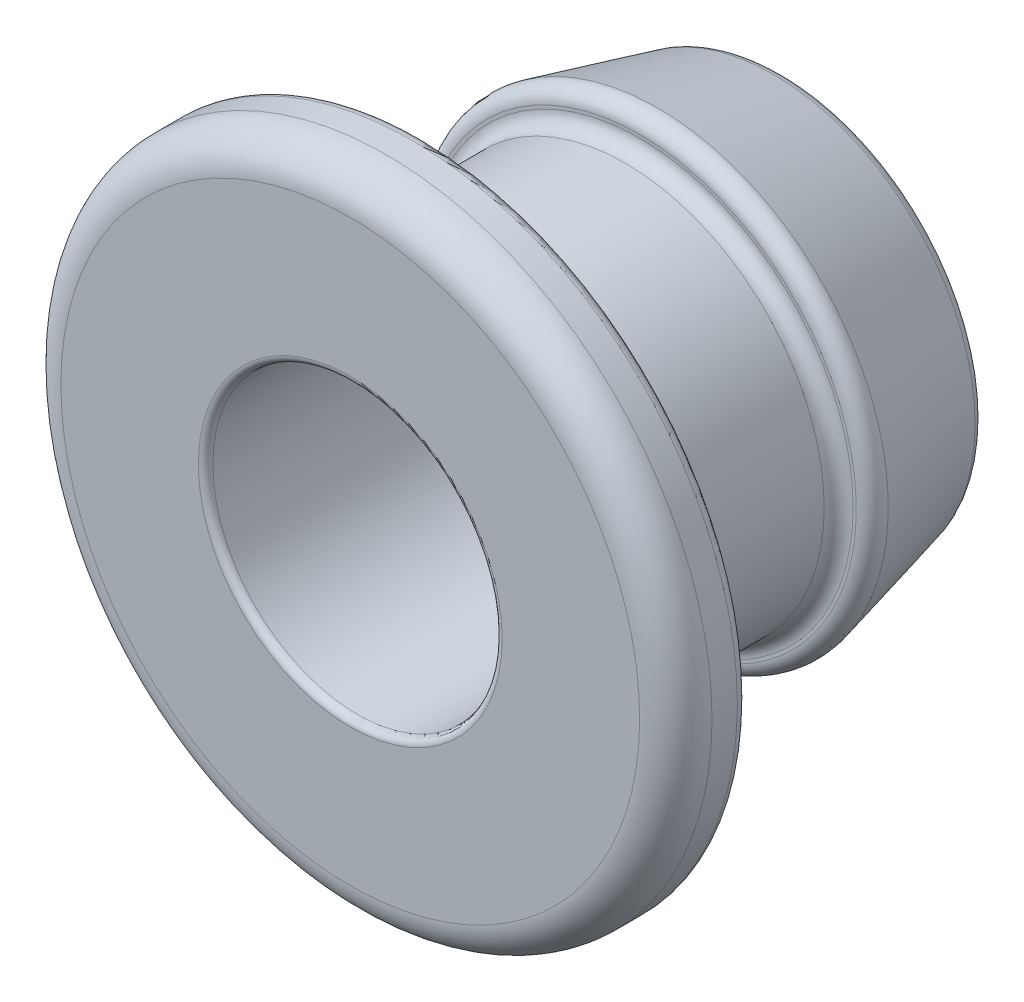
ISO-10303-21;
HEADER;
FILE_DESCRIPTION(('STEP AP214'),'2;1');
FILE_NAME('part.step','',(''),(''),'','','');
FILE_SCHEMA(('AUTOMOTIVE_DESIGN { 1 0 10303 214 1 1 1 1 }'));
ENDSEC;
DATA;
#1=APPLICATION_CONTEXT('core data for automotive mechanical design processes');
#2=APPLICATION_PROTOCOL_DEFINITION('international standard','automotive_design',2000,#1);
#3=PRODUCT_CONTEXT('',#1,'mechanical');
#4=PRODUCT('Part','Part','',(#3));
#5=PRODUCT_RELATED_PRODUCT_CATEGORY('part','',(#4));
#6=PRODUCT_DEFINITION_FORMATION('','',#4);
#7=PRODUCT_DEFINITION_CONTEXT('part definition',#1,'design');
#8=PRODUCT_DEFINITION('design','',#6,#7);
#9=PRODUCT_DEFINITION_SHAPE('','',#8);
#10=(LENGTH_UNIT() NAMED_UNIT(*) SI_UNIT(.MILLI.,.METRE.));
#11=(NAMED_UNIT(*) PLANE_ANGLE_UNIT() SI_UNIT($,.RADIAN.));
#12=(NAMED_UNIT(*) SI_UNIT($,.STERADIAN.) SOLID_ANGLE_UNIT());
#13=UNCERTAINTY_MEASURE_WITH_UNIT(LENGTH_MEASURE(1.E-05),#10,'distance_accuracy_value','');
#14=(GEOMETRIC_REPRESENTATION_CONTEXT(3) GLOBAL_UNCERTAINTY_ASSIGNED_CONTEXT((#13)) GLOBAL_UNIT_ASSIGNED_CONTEXT((#10,
#11,#12)) REPRESENTATION_CONTEXT('',''));
#15=CARTESIAN_POINT('',(0.,0.,0.));
#16=DIRECTION('',(0.,0.,1.));
#17=DIRECTION('',(1.,0.,0.));
#18=AXIS2_PLACEMENT_3D('',#15,#16,#17);
#19=CARTESIAN_POINT('',(1.09510500280763E-13,0.,9.8999999946356));
#20=DIRECTION('',(0.,0.,-1.));
#21=DIRECTION('',(-1.,0.,0.));
#22=AXIS2_PLACEMENT_3D('',#19,#20,#21);
#23=TOROIDAL_SURFACE('',#22,4.,0.5);
#24=CARTESIAN_POINT('',(1.09510500280763E-13,0.,9.8999999946356));
#25=DIRECTION('',(0.,0.,1.));
#26=DIRECTION('',(1.,0.,0.));
#27=AXIS2_PLACEMENT_3D('',#24,#25,#26);
#28=CIRCLE('',#27,4.5);
#29=CARTESIAN_POINT('',(4.50000000000011,0.,9.89999999463554));
#30=VERTEX_POINT('',#29);
#31=CARTESIAN_POINT('',(-4.49999999999989,0.,9.89999999463565));
#32=VERTEX_POINT('',#31);
#33=EDGE_CURVE('E152',#30,#32,#28,.T.);
#34=ORIENTED_EDGE('',*,*,#33,.T.);
#35=CARTESIAN_POINT('',(1.09510500280763E-13,0.,9.8999999946356));
#36=DIRECTION('',(0.,0.,1.));
#37=DIRECTION('',(1.,0.,0.));
#38=AXIS2_PLACEMENT_3D('',#35,#36,#37);
#39=CIRCLE('',#38,4.5);
#40=EDGE_CURVE('E156',#32,#30,#39,.T.);
#41=ORIENTED_EDGE('',*,*,#40,.T.);
#42=CARTESIAN_POINT('',(4.00000000000011,0.,9.89999999463555));
#43=DIRECTION('',(0.,-1.,0.));
#44=DIRECTION('',(1.,0.,0.));
#45=AXIS2_PLACEMENT_3D('',#42,#43,#44);
#46=CIRCLE('',#45,0.5);
#47=CARTESIAN_POINT('',(4.00000000000012,0.,10.3999999946356));
#48=VERTEX_POINT('',#47);
#49=EDGE_CURVE('E11',#30,#48,#46,.T.);
#50=ORIENTED_EDGE('',*,*,#49,.T.);
#51=CARTESIAN_POINT('',(1.15631708112494E-13,0.,10.3999999946356));
#52=DIRECTION('',(0.,0.,-1.));
#53=DIRECTION('',(1.,0.,0.));
#54=AXIS2_PLACEMENT_3D('',#51,#52,#53);
#55=CIRCLE('',#54,4.);
#56=EDGE_CURVE('E25',#48,#48,#55,.T.);
#57=ORIENTED_EDGE('',*,*,#56,.T.);
#58=ORIENTED_EDGE('',*,*,#49,.F.);
#59=EDGE_LOOP('',(#34,#41,#50,#57,#58));
#60=FACE_BOUND('',#59,.T.);
#61=ADVANCED_FACE('F17',(#60),#23,.T.);
#62=CARTESIAN_POINT('',(1.13890160039306E-13,0.,10.3999999946356));
#63=DIRECTION('',(0.,0.,1.));
#64=DIRECTION('',(1.,0.,0.));
#65=AXIS2_PLACEMENT_3D('',#62,#63,#64);
#66=PLANE('',#65);
#67=CARTESIAN_POINT('',(1.07551030389132E-13,0.,10.3999999946356));
#68=DIRECTION('',(0.,0.,1.));
#69=DIRECTION('',(-1.,0.,0.));
#70=AXIS2_PLACEMENT_3D('',#67,#68,#69);
#71=CIRCLE('',#70,2.1);
#72=CARTESIAN_POINT('',(2.10000000000011,0.,10.3999999946356));
#73=VERTEX_POINT('',#72);
#74=EDGE_CURVE('E177',#73,#73,#71,.T.);
#75=ORIENTED_EDGE('',*,*,#74,.F.);
#76=EDGE_LOOP('',(#75));
#77=FACE_BOUND('',#76,.T.);
#78=ORIENTED_EDGE('',*,*,#56,.F.);
#79=EDGE_LOOP('',(#78));
#80=FACE_BOUND('',#79,.T.);
#81=ADVANCED_FACE('F235',(#77,#80),#66,.T.);
#82=CARTESIAN_POINT('',(1.06326788822785E-13,0.,10.2999999946356));
#83=DIRECTION('',(0.,0.,-1.));
#84=DIRECTION('',(-1.,0.,0.));
#85=AXIS2_PLACEMENT_3D('',#82,#83,#84);
#86=TOROIDAL_SURFACE('',#85,2.1,0.1);
#87=ORIENTED_EDGE('',*,*,#74,.T.);
#88=CARTESIAN_POINT('',(2.10000000000011,0.,10.2999999946356));
#89=DIRECTION('',(0.,-1.,0.));
#90=DIRECTION('',(1.,0.,0.));
#91=AXIS2_PLACEMENT_3D('',#88,#89,#90);
#92=CIRCLE('',#91,0.1);
#93=CARTESIAN_POINT('',(2.00000000000011,0.,10.2999999946356));
#94=VERTEX_POINT('',#93);
#95=EDGE_CURVE('E44',#73,#94,#92,.T.);
#96=ORIENTED_EDGE('',*,*,#95,.T.);
#97=CARTESIAN_POINT('',(1.06326788822785E-13,0.,10.2999999946356));
#98=DIRECTION('',(0.,0.,-1.));
#99=DIRECTION('',(-1.,0.,0.));
#100=AXIS2_PLACEMENT_3D('',#97,#98,#99);
#101=CIRCLE('',#100,2.);
#102=CARTESIAN_POINT('',(-1.99999999999989,0.,10.2999999946356));
#103=VERTEX_POINT('',#102);
#104=EDGE_CURVE('E199',#94,#103,#101,.T.);
#105=ORIENTED_EDGE('',*,*,#104,.T.);
#106=CARTESIAN_POINT('',(1.06326788822785E-13,0.,10.2999999946356));
#107=DIRECTION('',(0.,0.,-1.));
#108=DIRECTION('',(-1.,0.,0.));
#109=AXIS2_PLACEMENT_3D('',#106,#107,#108);
#110=CIRCLE('',#109,2.);
#111=EDGE_CURVE('E203',#103,#94,#110,.T.);
#112=ORIENTED_EDGE('',*,*,#111,.T.);
#113=ORIENTED_EDGE('',*,*,#95,.F.);
#114=EDGE_LOOP('',(#87,#96,#105,#112,#113));
#115=FACE_BOUND('',#114,.T.);
#116=ADVANCED_FACE('F237',(#115),#86,.T.);
#117=CARTESIAN_POINT('',(0.,0.,6.59999999463559));
#118=DIRECTION('',(0.,0.,1.));
#119=DIRECTION('',(1.,0.,0.));
#120=AXIS2_PLACEMENT_3D('',#117,#118,#119);
#121=TOROIDAL_SURFACE('',#120,2.95,0.2);
#122=CARTESIAN_POINT('',(0.,0.,6.59999999463559));
#123=DIRECTION('',(0.,0.,-1.));
#124=DIRECTION('',(-1.,0.,0.));
#125=AXIS2_PLACEMENT_3D('',#122,#123,#124);
#126=CIRCLE('',#125,2.75);
#127=CARTESIAN_POINT('',(-2.74999999999993,0.,6.59999999463561));
#128=VERTEX_POINT('',#127);
#129=EDGE_CURVE('E150',#128,#128,#126,.T.);
#130=ORIENTED_EDGE('',*,*,#129,.T.);
#131=CARTESIAN_POINT('',(-2.94999999999993,0.,6.59999999463562));
#132=DIRECTION('',(0.,1.,0.));
#133=DIRECTION('',(-1.,0.,0.));
#134=AXIS2_PLACEMENT_3D('',#131,#132,#133);
#135=CIRCLE('',#134,0.2);
#136=CARTESIAN_POINT('',(-2.94999999999993,0.,6.39999999463562));
#137=VERTEX_POINT('',#136);
#138=EDGE_CURVE('E227',#128,#137,#135,.T.);
#139=ORIENTED_EDGE('',*,*,#138,.T.);
#140=CARTESIAN_POINT('',(0.,0.,6.39999999463559));
#141=DIRECTION('',(0.,0.,1.));
#142=DIRECTION('',(-1.,0.,0.));
#143=AXIS2_PLACEMENT_3D('',#140,#141,#142);
#144=CIRCLE('',#143,2.95);
#145=EDGE_CURVE('E223',#137,#137,#144,.T.);
#146=ORIENTED_EDGE('',*,*,#145,.T.);
#147=ORIENTED_EDGE('',*,*,#138,.F.);
#148=EDGE_LOOP('',(#130,#139,#146,#147));
#149=FACE_BOUND('',#148,.T.);
#150=ADVANCED_FACE('F245',(#149),#121,.F.);
#151=CARTESIAN_POINT('',(2.75000000000007,0.,6.39999999463556));
#152=DIRECTION('',(0.,0.,1.));
#153=DIRECTION('',(1.,0.,0.));
#154=AXIS2_PLACEMENT_3D('',#151,#152,#153);
#155=PLANE('',#154);
#156=ORIENTED_EDGE('',*,*,#145,.F.);
#157=EDGE_LOOP('',(#156));
#158=FACE_BOUND('',#157,.T.);
#159=CARTESIAN_POINT('',(0.,0.,6.39999999463559));
#160=DIRECTION('',(0.,0.,-1.));
#161=DIRECTION('',(-1.,0.,0.));
#162=AXIS2_PLACEMENT_3D('',#159,#160,#161);
#163=CIRCLE('',#162,2.99384471871913);
#164=CARTESIAN_POINT('',(-2.99384471871906,0.,6.39999999463562));
#165=VERTEX_POINT('',#164);
#166=EDGE_CURVE('E216',#165,#165,#163,.T.);
#167=ORIENTED_EDGE('',*,*,#166,.F.);
#168=EDGE_LOOP('',(#167));
#169=FACE_BOUND('',#168,.T.);
#170=ADVANCED_FACE('F251',(#158,#169),#155,.T.);
#171=CARTESIAN_POINT('',(0.,0.,6.19999999463559));
#172=DIRECTION('',(0.,0.,1.));
#173=DIRECTION('',(1.,0.,0.));
#174=AXIS2_PLACEMENT_3D('',#171,#172,#173);
#175=TOROIDAL_SURFACE('',#174,2.99384471871913,0.2);
#176=ORIENTED_EDGE('',*,*,#166,.T.);
#177=CARTESIAN_POINT('',(-2.99384471871907,0.,6.19999999463562));
#178=DIRECTION('',(0.,-1.,0.));
#179=DIRECTION('',(-1.,0.,0.));
#180=AXIS2_PLACEMENT_3D('',#177,#178,#179);
#181=CIRCLE('',#180,0.2);
#182=CARTESIAN_POINT('',(-3.18787321874813,0.,6.15149286962836));
#183=VERTEX_POINT('',#182);
#184=EDGE_CURVE('E220',#165,#183,#181,.T.);
#185=ORIENTED_EDGE('',*,*,#184,.T.);
#186=CARTESIAN_POINT('',(0.,0.,6.15149286962832));
#187=DIRECTION('',(0.,0.,1.));
#188=DIRECTION('',(-1.,0.,0.));
#189=AXIS2_PLACEMENT_3D('',#186,#187,#188);
#190=CIRCLE('',#189,3.18787321874819);
#191=EDGE_CURVE('E140',#183,#183,#190,.T.);
#192=ORIENTED_EDGE('',*,*,#191,.T.);
#193=ORIENTED_EDGE('',*,*,#184,.F.);
#194=EDGE_LOOP('',(#176,#185,#192,#193));
#195=FACE_BOUND('',#194,.T.);
#196=ADVANCED_FACE('F257',(#195),#175,.T.);
#197=CARTESIAN_POINT('',(0.,0.,5.39999999463559));
#198=DIRECTION('',(0.,0.,1.));
#199=DIRECTION('',(1.,0.,0.));
#200=AXIS2_PLACEMENT_3D('',#197,#198,#199);
#201=CONICAL_SURFACE('',#200,3.,0.244978663126864);
#202=ORIENTED_EDGE('',*,*,#191,.F.);
#203=DIRECTION('',(0.242535625036322,0.,-0.970142500145335));
#204=VECTOR('',#203,1.);
#205=CARTESIAN_POINT('',(-2.99999999999996,0.,5.39999999463562));
#206=LINE('',#205,#204);
#207=CARTESIAN_POINT('',(-2.78787321874815,0.,4.55149286962836));
#208=VERTEX_POINT('',#207);
#209=EDGE_CURVE('E213',#183,#208,#206,.T.);
#210=ORIENTED_EDGE('',*,*,#209,.T.);
#211=CARTESIAN_POINT('',(0.,0.,4.55149286962832));
#212=DIRECTION('',(0.,0.,-1.));
#213=DIRECTION('',(1.,0.,0.));
#214=AXIS2_PLACEMENT_3D('',#211,#212,#213);
#215=CIRCLE('',#214,2.78787321874819);
#216=EDGE_CURVE('E206',#208,#208,#215,.T.);
#217=ORIENTED_EDGE('',*,*,#216,.F.);
#218=ORIENTED_EDGE('',*,*,#209,.F.);
#219=EDGE_LOOP('',(#202,#210,#217,#218));
#220=FACE_BOUND('',#219,.T.);
#221=ADVANCED_FACE('F253',(#220),#201,.T.);
#222=CARTESIAN_POINT('',(0.,0.,4.59999999463559));
#223=DIRECTION('',(0.,0.,1.));
#224=DIRECTION('',(1.,0.,0.));
#225=AXIS2_PLACEMENT_3D('',#222,#223,#224);
#226=TOROIDAL_SURFACE('',#225,2.59384471871913,0.2);
#227=ORIENTED_EDGE('',*,*,#216,.T.);
#228=CARTESIAN_POINT('',(-2.59384471871909,0.,4.59999999463562));
#229=DIRECTION('',(0.,-1.,0.));
#230=DIRECTION('',(-1.,0.,0.));
#231=AXIS2_PLACEMENT_3D('',#228,#229,#230);
#232=CIRCLE('',#231,0.2);
#233=CARTESIAN_POINT('',(-2.59384471871909,0.,4.39999999463562));
#234=VERTEX_POINT('',#233);
#235=EDGE_CURVE('E210',#208,#234,#232,.T.);
#236=ORIENTED_EDGE('',*,*,#235,.T.);
#237=CARTESIAN_POINT('',(0.,0.,4.39999999463559));
#238=DIRECTION('',(0.,0.,1.));
#239=DIRECTION('',(1.,0.,0.));
#240=AXIS2_PLACEMENT_3D('',#237,#238,#239);
#241=CIRCLE('',#240,2.59384471871913);
#242=EDGE_CURVE('E191',#234,#234,#241,.T.);
#243=ORIENTED_EDGE('',*,*,#242,.T.);
#244=ORIENTED_EDGE('',*,*,#235,.F.);
#245=EDGE_LOOP('',(#227,#236,#243,#244));
#246=FACE_BOUND('',#245,.T.);
#247=ADVANCED_FACE('F256',(#246),#226,.T.);
#248=CARTESIAN_POINT('',(0.,0.,8.59999999463559));
#249=DIRECTION('',(0.,0.,1.));
#250=DIRECTION('',(1.,0.,0.));
#251=AXIS2_PLACEMENT_3D('',#248,#249,#250);
#252=CYLINDRICAL_SURFACE('',#251,2.);
#253=CARTESIAN_POINT('',(0.,0.,4.59999999463559));
#254=DIRECTION('',(0.,0.,1.));
#255=DIRECTION('',(1.,0.,0.));
#256=AXIS2_PLACEMENT_3D('',#253,#254,#255);
#257=CIRCLE('',#256,2.);
#258=CARTESIAN_POINT('',(-1.99999999999996,0.,4.59999999463561));
#259=VERTEX_POINT('',#258);
#260=CARTESIAN_POINT('',(2.00000000000004,0.,4.59999999463557));
#261=VERTEX_POINT('',#260);
#262=EDGE_CURVE('E162',#259,#261,#257,.T.);
#263=ORIENTED_EDGE('',*,*,#262,.F.);
#264=DIRECTION('',(0.,0.,1.));
#265=VECTOR('',#264,1.);
#266=CARTESIAN_POINT('',(-1.99999999999991,0.,8.59999999463561));
#267=LINE('',#266,#265);
#268=EDGE_CURVE('E195',#259,#103,#267,.T.);
#269=ORIENTED_EDGE('',*,*,#268,.T.);
#270=ORIENTED_EDGE('',*,*,#104,.F.);
#271=ORIENTED_EDGE('',*,*,#111,.F.);
#272=ORIENTED_EDGE('',*,*,#268,.F.);
#273=CARTESIAN_POINT('',(0.,0.,4.59999999463559));
#274=DIRECTION('',(0.,0.,1.));
#275=DIRECTION('',(1.,0.,0.));
#276=AXIS2_PLACEMENT_3D('',#273,#274,#275);
#277=CIRCLE('',#276,2.);
#278=EDGE_CURVE('E187',#261,#259,#277,.T.);
#279=ORIENTED_EDGE('',*,*,#278,.F.);
#280=EDGE_LOOP('',(#263,#269,#270,#271,#272,#279));
#281=FACE_BOUND('',#280,.T.);
#282=ADVANCED_FACE('F259',(#281),#252,.F.);
#283=CARTESIAN_POINT('',(0.,0.,4.39999999463559));
#284=DIRECTION('',(0.,0.,1.));
#285=DIRECTION('',(1.,0.,0.));
#286=AXIS2_PLACEMENT_3D('',#283,#284,#285);
#287=PLANE('',#286);
#288=CARTESIAN_POINT('',(0.,0.,4.39999999463559));
#289=DIRECTION('',(0.,0.,-1.));
#290=DIRECTION('',(1.,0.,0.));
#291=AXIS2_PLACEMENT_3D('',#288,#289,#290);
#292=CIRCLE('',#291,2.2);
#293=CARTESIAN_POINT('',(2.20000000000004,0.,4.39999999463556));
#294=VERTEX_POINT('',#293);
#295=EDGE_CURVE('E161',#294,#294,#292,.T.);
#296=ORIENTED_EDGE('',*,*,#295,.F.);
#297=EDGE_LOOP('',(#296));
#298=FACE_BOUND('',#297,.T.);
#299=ORIENTED_EDGE('',*,*,#242,.F.);
#300=EDGE_LOOP('',(#299));
#301=FACE_BOUND('',#300,.T.);
#302=ADVANCED_FACE('F262',(#298,#301),#287,.F.);
#303=CARTESIAN_POINT('',(0.,0.,4.59999999463559));
#304=DIRECTION('',(0.,0.,-1.));
#305=DIRECTION('',(-1.,0.,0.));
#306=AXIS2_PLACEMENT_3D('',#303,#304,#305);
#307=TOROIDAL_SURFACE('',#306,2.2,0.2);
#308=ORIENTED_EDGE('',*,*,#262,.T.);
#309=CARTESIAN_POINT('',(2.20000000000004,0.,4.59999999463556));
#310=DIRECTION('',(0.,-1.,0.));
#311=DIRECTION('',(1.,0.,0.));
#312=AXIS2_PLACEMENT_3D('',#309,#310,#311);
#313=CIRCLE('',#312,0.2);
#314=EDGE_CURVE('E157',#261,#294,#313,.T.);
#315=ORIENTED_EDGE('',*,*,#314,.T.);
#316=ORIENTED_EDGE('',*,*,#295,.T.);
#317=ORIENTED_EDGE('',*,*,#314,.F.);
#318=ORIENTED_EDGE('',*,*,#278,.T.);
#319=EDGE_LOOP('',(#308,#315,#316,#317,#318));
#320=FACE_BOUND('',#319,.T.);
#321=ADVANCED_FACE('F269',(#320),#307,.T.);
#322=CARTESIAN_POINT('',(0.,0.,8.59999999463559));
#323=DIRECTION('',(0.,0.,1.));
#324=DIRECTION('',(1.,0.,0.));
#325=AXIS2_PLACEMENT_3D('',#322,#323,#324);
#326=CYLINDRICAL_SURFACE('',#325,2.75);
#327=CARTESIAN_POINT('',(1.03422643347312E-13,0.,9.24999999463559));
#328=DIRECTION('',(0.,0.,1.));
#329=DIRECTION('',(1.,0.,0.));
#330=AXIS2_PLACEMENT_3D('',#327,#328,#329);
#331=CIRCLE('',#330,2.75);
#332=CARTESIAN_POINT('',(-2.7499999999999,0.,9.24999999463562));
#333=VERTEX_POINT('',#332);
#334=CARTESIAN_POINT('',(2.7500000000001,0.,9.24999999463556));
#335=VERTEX_POINT('',#334);
#336=EDGE_CURVE('E163',#333,#335,#331,.T.);
#337=ORIENTED_EDGE('',*,*,#336,.F.);
#338=DIRECTION('',(0.,0.,-1.));
#339=VECTOR('',#338,1.);
#340=CARTESIAN_POINT('',(-2.7499999999999,0.,8.59999999463562));
#341=LINE('',#340,#339);
#342=EDGE_CURVE('E146',#333,#128,#341,.T.);
#343=ORIENTED_EDGE('',*,*,#342,.T.);
#344=ORIENTED_EDGE('',*,*,#129,.F.);
#345=ORIENTED_EDGE('',*,*,#342,.F.);
#346=CARTESIAN_POINT('',(1.03422643347312E-13,0.,9.24999999463559));
#347=DIRECTION('',(0.,0.,1.));
#348=DIRECTION('',(1.,0.,0.));
#349=AXIS2_PLACEMENT_3D('',#346,#347,#348);
#350=CIRCLE('',#349,2.75);
#351=EDGE_CURVE('E151',#335,#333,#350,.T.);
#352=ORIENTED_EDGE('',*,*,#351,.F.);
#353=EDGE_LOOP('',(#337,#343,#344,#345,#352));
#354=FACE_BOUND('',#353,.T.);
#355=ADVANCED_FACE('F273',(#354),#326,.T.);
#356=CARTESIAN_POINT('',(1.03422643347312E-13,0.,9.24999999463559));
#357=DIRECTION('',(0.,0.,-1.));
#358=DIRECTION('',(-1.,0.,0.));
#359=AXIS2_PLACEMENT_3D('',#356,#357,#358);
#360=TOROIDAL_SURFACE('',#359,2.9,0.15);
#361=ORIENTED_EDGE('',*,*,#336,.T.);
#362=CARTESIAN_POINT('',(2.9000000000001,0.,9.24999999463556));
#363=DIRECTION('',(0.,1.,0.));
#364=DIRECTION('',(1.,0.,0.));
#365=AXIS2_PLACEMENT_3D('',#362,#363,#364);
#366=CIRCLE('',#365,0.15);
#367=CARTESIAN_POINT('',(2.90000000000011,0.,9.39999999463556));
#368=VERTEX_POINT('',#367);
#369=EDGE_CURVE('E167',#335,#368,#366,.T.);
#370=ORIENTED_EDGE('',*,*,#369,.T.);
#371=CARTESIAN_POINT('',(1.05259005696831E-13,0.,9.39999999463559));
#372=DIRECTION('',(0.,0.,-1.));
#373=DIRECTION('',(1.,0.,0.));
#374=AXIS2_PLACEMENT_3D('',#371,#372,#373);
#375=CIRCLE('',#374,2.9);
#376=EDGE_CURVE('E145',#368,#368,#375,.T.);
#377=ORIENTED_EDGE('',*,*,#376,.T.);
#378=ORIENTED_EDGE('',*,*,#369,.F.);
#379=ORIENTED_EDGE('',*,*,#351,.T.);
#380=EDGE_LOOP('',(#361,#370,#377,#378,#379));
#381=FACE_BOUND('',#380,.T.);
#382=ADVANCED_FACE('F276',(#381),#360,.F.);
#383=CARTESIAN_POINT('',(1.05008375842305E-13,0.,9.39999999463559));
#384=DIRECTION('',(0.,0.,1.));
#385=DIRECTION('',(1.,0.,0.));
#386=AXIS2_PLACEMENT_3D('',#383,#384,#385);
#387=CYLINDRICAL_SURFACE('',#386,4.5);
#388=ORIENTED_EDGE('',*,*,#33,.F.);
#389=ORIENTED_EDGE('',*,*,#40,.F.);
#390=DIRECTION('',(0.,0.,-1.));
#391=VECTOR('',#390,1.);
#392=CARTESIAN_POINT('',(-4.4999999999999,0.,9.39999999463563));
#393=LINE('',#392,#391);
#394=CARTESIAN_POINT('',(-4.49999999999989,0.,9.54999999463565));
#395=VERTEX_POINT('',#394);
#396=EDGE_CURVE('E168',#32,#395,#393,.T.);
#397=ORIENTED_EDGE('',*,*,#396,.T.);
#398=CARTESIAN_POINT('',(1.06359013173842E-13,0.,9.54999999463559));
#399=DIRECTION('',(0.,0.,-1.));
#400=DIRECTION('',(1.,0.,0.));
#401=AXIS2_PLACEMENT_3D('',#398,#399,#400);
#402=CIRCLE('',#401,4.5);
#403=CARTESIAN_POINT('',(4.50000000000011,0.,9.54999999463553));
#404=VERTEX_POINT('',#403);
#405=EDGE_CURVE('E131',#404,#395,#402,.T.);
#406=ORIENTED_EDGE('',*,*,#405,.F.);
#407=CARTESIAN_POINT('',(1.06359013173842E-13,0.,9.54999999463559));
#408=DIRECTION('',(0.,0.,-1.));
#409=DIRECTION('',(1.,0.,0.));
#410=AXIS2_PLACEMENT_3D('',#407,#408,#409);
#411=CIRCLE('',#410,4.5);
#412=EDGE_CURVE('E128',#395,#404,#411,.T.);
#413=ORIENTED_EDGE('',*,*,#412,.F.);
#414=ORIENTED_EDGE('',*,*,#396,.F.);
#415=EDGE_LOOP('',(#388,#389,#397,#406,#413,#414));
#416=FACE_BOUND('',#415,.T.);
#417=ADVANCED_FACE('F281',(#416),#387,.T.);
#418=CARTESIAN_POINT('',(1.05008375842305E-13,0.,9.39999999463559));
#419=DIRECTION('',(0.,0.,1.));
#420=DIRECTION('',(1.,0.,0.));
#421=AXIS2_PLACEMENT_3D('',#418,#419,#420);
#422=PLANE('',#421);
#423=ORIENTED_EDGE('',*,*,#376,.F.);
#424=EDGE_LOOP('',(#423));
#425=FACE_BOUND('',#424,.T.);
#426=CARTESIAN_POINT('',(1.04522650824323E-13,0.,9.39999999463559));
#427=DIRECTION('',(0.,0.,1.));
#428=DIRECTION('',(1.,0.,0.));
#429=AXIS2_PLACEMENT_3D('',#426,#427,#428);
#430=CIRCLE('',#429,4.35);
#431=CARTESIAN_POINT('',(4.3500000000001,0.,9.39999999463554));
#432=VERTEX_POINT('',#431);
#433=EDGE_CURVE('E125',#432,#432,#430,.T.);
#434=ORIENTED_EDGE('',*,*,#433,.F.);
#435=EDGE_LOOP('',(#434));
#436=FACE_BOUND('',#435,.T.);
#437=ADVANCED_FACE('F285',(#425,#436),#422,.F.);
#438=CARTESIAN_POINT('',(1.06359013173842E-13,0.,9.54999999463559));
#439=DIRECTION('',(0.,0.,-1.));
#440=DIRECTION('',(-1.,0.,0.));
#441=AXIS2_PLACEMENT_3D('',#438,#439,#440);
#442=TOROIDAL_SURFACE('',#441,4.35,0.15);
#443=ORIENTED_EDGE('',*,*,#433,.T.);
#444=CARTESIAN_POINT('',(4.35000000000011,0.,9.54999999463554));
#445=DIRECTION('',(0.,-1.,0.));
#446=DIRECTION('',(1.,0.,0.));
#447=AXIS2_PLACEMENT_3D('',#444,#445,#446);
#448=CIRCLE('',#447,0.15);
#449=EDGE_CURVE('E122',#432,#404,#448,.T.);
#450=ORIENTED_EDGE('',*,*,#449,.T.);
#451=ORIENTED_EDGE('',*,*,#405,.T.);
#452=ORIENTED_EDGE('',*,*,#412,.T.);
#453=ORIENTED_EDGE('',*,*,#449,.F.);
#454=EDGE_LOOP('',(#443,#450,#451,#452,#453));
#455=FACE_BOUND('',#454,.T.);
#456=ADVANCED_FACE('F123',(#455),#442,.T.);
#457=CLOSED_SHELL('',(#61,#81,#116,#150,#170,#196,#221,#247,#282,#302,#321,#355,#382,#417,#437,#456));
#458=MANIFOLD_SOLID_BREP('B1',#457);
#459=ADVANCED_BREP_SHAPE_REPRESENTATION('',(#18,#458),#14);
#460=SHAPE_DEFINITION_REPRESENTATION(#9,#459);
ENDSEC;
END-ISO-10303-21;
